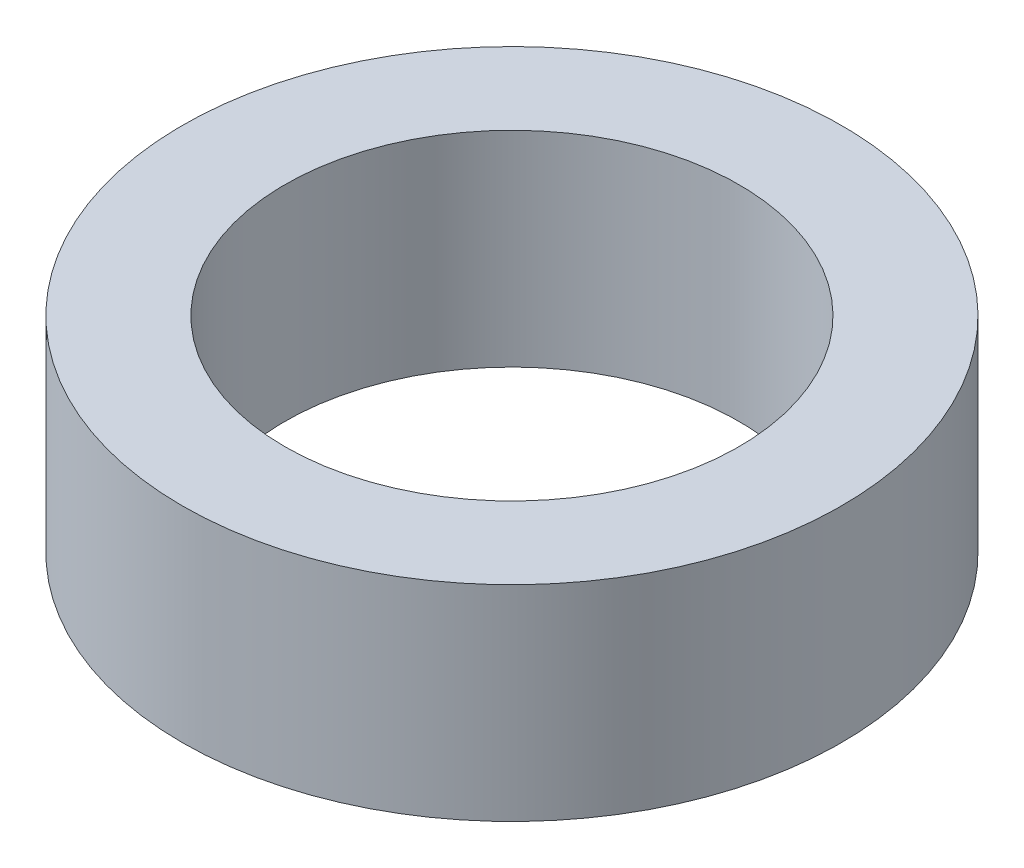
ISO-10303-21;
HEADER;
FILE_DESCRIPTION(('STEP AP214'),'2;1');
FILE_NAME('part.step','',(''),(''),'','','');
FILE_SCHEMA(('AUTOMOTIVE_DESIGN { 1 0 10303 214 1 1 1 1 }'));
ENDSEC;
DATA;
#1=APPLICATION_CONTEXT('core data for automotive mechanical design processes');
#2=APPLICATION_PROTOCOL_DEFINITION('international standard','automotive_design',2000,#1);
#3=PRODUCT_CONTEXT('',#1,'mechanical');
#4=PRODUCT('Part','Part','',(#3));
#5=PRODUCT_RELATED_PRODUCT_CATEGORY('part','',(#4));
#6=PRODUCT_DEFINITION_FORMATION('','',#4);
#7=PRODUCT_DEFINITION_CONTEXT('part definition',#1,'design');
#8=PRODUCT_DEFINITION('design','',#6,#7);
#9=PRODUCT_DEFINITION_SHAPE('','',#8);
#10=(LENGTH_UNIT() NAMED_UNIT(*) SI_UNIT(.MILLI.,.METRE.));
#11=(NAMED_UNIT(*) PLANE_ANGLE_UNIT() SI_UNIT($,.RADIAN.));
#12=(NAMED_UNIT(*) SI_UNIT($,.STERADIAN.) SOLID_ANGLE_UNIT());
#13=UNCERTAINTY_MEASURE_WITH_UNIT(LENGTH_MEASURE(1.E-05),#10,'distance_accuracy_value','');
#14=(GEOMETRIC_REPRESENTATION_CONTEXT(3) GLOBAL_UNCERTAINTY_ASSIGNED_CONTEXT((#13)) GLOBAL_UNIT_ASSIGNED_CONTEXT((#10,
#11,#12)) REPRESENTATION_CONTEXT('',''));
#15=CARTESIAN_POINT('',(0.,0.,0.));
#16=DIRECTION('',(0.,0.,1.));
#17=DIRECTION('',(1.,0.,0.));
#18=AXIS2_PLACEMENT_3D('',#15,#16,#17);
#19=CARTESIAN_POINT('',(0.,6.35,0.));
#20=DIRECTION('',(0.,-1.,0.));
#21=DIRECTION('',(0.,0.,-1.));
#22=AXIS2_PLACEMENT_3D('',#19,#20,#21);
#23=CYLINDRICAL_SURFACE('',#22,7.03012806053458);
#24=CARTESIAN_POINT('',(0.,6.35,0.));
#25=DIRECTION('',(0.,1.,0.));
#26=DIRECTION('',(0.,0.,1.));
#27=AXIS2_PLACEMENT_3D('',#24,#25,#26);
#28=CIRCLE('',#27,7.03012806053458);
#29=CARTESIAN_POINT('',(0.,6.35,7.03012806053458));
#30=VERTEX_POINT('',#29);
#31=EDGE_CURVE('E40',#30,#30,#28,.T.);
#32=ORIENTED_EDGE('',*,*,#31,.T.);
#33=EDGE_LOOP('',(#32));
#34=FACE_BOUND('',#33,.T.);
#35=CARTESIAN_POINT('',(0.,0.,0.));
#36=DIRECTION('',(0.,1.,0.));
#37=DIRECTION('',(0.,0.,1.));
#38=AXIS2_PLACEMENT_3D('',#35,#36,#37);
#39=CIRCLE('',#38,7.03012806053458);
#40=CARTESIAN_POINT('',(0.,0.,7.03012806053458));
#41=VERTEX_POINT('',#40);
#42=EDGE_CURVE('E46',#41,#41,#39,.T.);
#43=ORIENTED_EDGE('',*,*,#42,.F.);
#44=EDGE_LOOP('',(#43));
#45=FACE_BOUND('',#44,.T.);
#46=ADVANCED_FACE('F33',(#34,#45),#23,.F.);
#47=CARTESIAN_POINT('',(0.,6.35,0.));
#48=DIRECTION('',(0.,-1.,0.));
#49=DIRECTION('',(0.,0.,-1.));
#50=AXIS2_PLACEMENT_3D('',#47,#48,#49);
#51=CYLINDRICAL_SURFACE('',#50,10.2051280605346);
#52=CARTESIAN_POINT('',(0.,6.35,0.));
#53=DIRECTION('',(0.,1.,0.));
#54=DIRECTION('',(0.,0.,1.));
#55=AXIS2_PLACEMENT_3D('',#52,#53,#54);
#56=CIRCLE('',#55,10.2051280605346);
#57=CARTESIAN_POINT('',(0.,6.35,10.2051280605346));
#58=VERTEX_POINT('',#57);
#59=EDGE_CURVE('E10',#58,#58,#56,.T.);
#60=ORIENTED_EDGE('',*,*,#59,.F.);
#61=EDGE_LOOP('',(#60));
#62=FACE_BOUND('',#61,.T.);
#63=CARTESIAN_POINT('',(0.,0.,0.));
#64=DIRECTION('',(0.,1.,0.));
#65=DIRECTION('',(0.,0.,1.));
#66=AXIS2_PLACEMENT_3D('',#63,#64,#65);
#67=CIRCLE('',#66,10.2051280605346);
#68=CARTESIAN_POINT('',(0.,0.,10.2051280605346));
#69=VERTEX_POINT('',#68);
#70=EDGE_CURVE('E36',#69,#69,#67,.T.);
#71=ORIENTED_EDGE('',*,*,#70,.T.);
#72=EDGE_LOOP('',(#71));
#73=FACE_BOUND('',#72,.T.);
#74=ADVANCED_FACE('F53',(#62,#73),#51,.T.);
#75=CARTESIAN_POINT('',(0.,6.35,0.));
#76=DIRECTION('',(0.,1.,0.));
#77=DIRECTION('',(0.,0.,1.));
#78=AXIS2_PLACEMENT_3D('',#75,#76,#77);
#79=PLANE('',#78);
#80=ORIENTED_EDGE('',*,*,#31,.F.);
#81=EDGE_LOOP('',(#80));
#82=FACE_BOUND('',#81,.T.);
#83=ORIENTED_EDGE('',*,*,#59,.T.);
#84=EDGE_LOOP('',(#83));
#85=FACE_BOUND('',#84,.T.);
#86=ADVANCED_FACE('F57',(#82,#85),#79,.T.);
#87=CARTESIAN_POINT('',(0.,0.,0.));
#88=DIRECTION('',(0.,1.,0.));
#89=DIRECTION('',(0.,0.,1.));
#90=AXIS2_PLACEMENT_3D('',#87,#88,#89);
#91=PLANE('',#90);
#92=ORIENTED_EDGE('',*,*,#42,.T.);
#93=EDGE_LOOP('',(#92));
#94=FACE_BOUND('',#93,.T.);
#95=ORIENTED_EDGE('',*,*,#70,.F.);
#96=EDGE_LOOP('',(#95));
#97=FACE_BOUND('',#96,.T.);
#98=ADVANCED_FACE('F55',(#94,#97),#91,.F.);
#99=CLOSED_SHELL('',(#46,#74,#86,#98));
#100=MANIFOLD_SOLID_BREP('B2',#99);
#101=ADVANCED_BREP_SHAPE_REPRESENTATION('',(#18,#100),#14);
#102=SHAPE_DEFINITION_REPRESENTATION(#9,#101);
ENDSEC;
END-ISO-10303-21;
